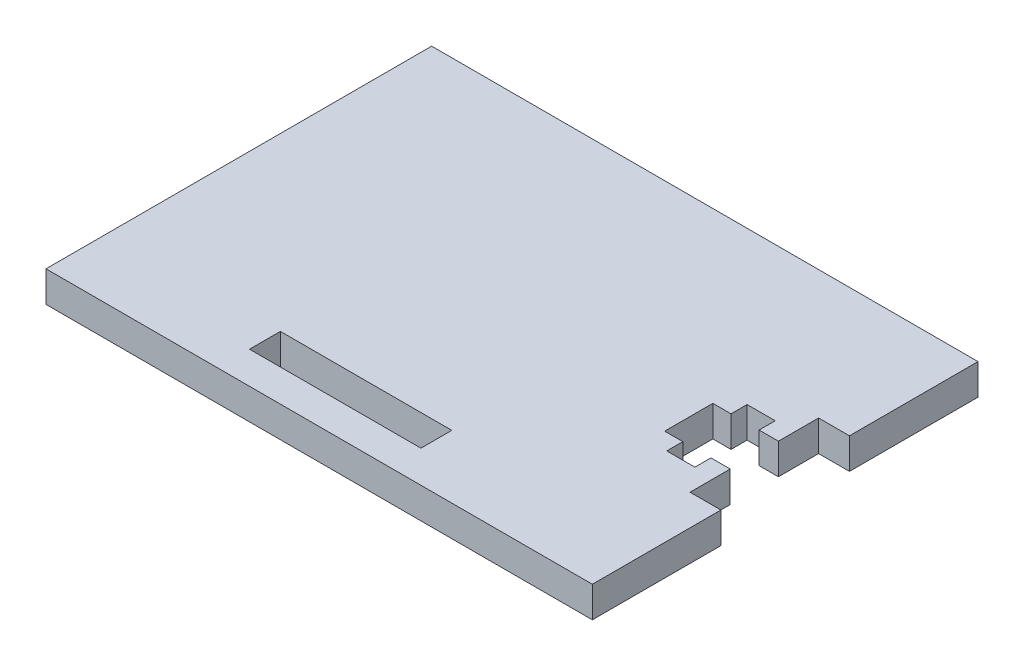
ISO-10303-21;
HEADER;
FILE_DESCRIPTION(('STEP AP214'),'2;1');
FILE_NAME('part.step','',(''),(''),'','','');
FILE_SCHEMA(('AUTOMOTIVE_DESIGN { 1 0 10303 214 1 1 1 1 }'));
ENDSEC;
DATA;
#1=APPLICATION_CONTEXT('core data for automotive mechanical design processes');
#2=APPLICATION_PROTOCOL_DEFINITION('international standard','automotive_design',2000,#1);
#3=PRODUCT_CONTEXT('',#1,'mechanical');
#4=PRODUCT('Part','Part','',(#3));
#5=PRODUCT_RELATED_PRODUCT_CATEGORY('part','',(#4));
#6=PRODUCT_DEFINITION_FORMATION('','',#4);
#7=PRODUCT_DEFINITION_CONTEXT('part definition',#1,'design');
#8=PRODUCT_DEFINITION('design','',#6,#7);
#9=PRODUCT_DEFINITION_SHAPE('','',#8);
#10=(LENGTH_UNIT() NAMED_UNIT(*) SI_UNIT(.MILLI.,.METRE.));
#11=(NAMED_UNIT(*) PLANE_ANGLE_UNIT() SI_UNIT($,.RADIAN.));
#12=(NAMED_UNIT(*) SI_UNIT($,.STERADIAN.) SOLID_ANGLE_UNIT());
#13=UNCERTAINTY_MEASURE_WITH_UNIT(LENGTH_MEASURE(1.E-05),#10,'distance_accuracy_value','');
#14=(GEOMETRIC_REPRESENTATION_CONTEXT(3) GLOBAL_UNCERTAINTY_ASSIGNED_CONTEXT((#13)) GLOBAL_UNIT_ASSIGNED_CONTEXT((#10,
#11,#12)) REPRESENTATION_CONTEXT('',''));
#15=CARTESIAN_POINT('',(0.,0.,0.));
#16=DIRECTION('',(0.,0.,1.));
#17=DIRECTION('',(1.,0.,0.));
#18=AXIS2_PLACEMENT_3D('',#15,#16,#17);
#19=CARTESIAN_POINT('',(0.,3.048,-25.4000000000001));
#20=DIRECTION('',(0.,0.,1.));
#21=DIRECTION('',(1.,0.,0.));
#22=AXIS2_PLACEMENT_3D('',#19,#20,#21);
#23=PLANE('',#22);
#24=DIRECTION('',(-1.,0.,0.));
#25=VECTOR('',#24,1.);
#26=CARTESIAN_POINT('',(0.,0.,-25.4000000000001));
#27=LINE('',#26,#25);
#28=CARTESIAN_POINT('',(53.975,0.,-25.4));
#29=VERTEX_POINT('',#28);
#30=CARTESIAN_POINT('',(50.927,0.,-25.4));
#31=VERTEX_POINT('',#30);
#32=EDGE_CURVE('E245',#29,#31,#27,.T.);
#33=ORIENTED_EDGE('',*,*,#32,.F.);
#34=DIRECTION('',(0.,-1.,0.));
#35=VECTOR('',#34,1.);
#36=CARTESIAN_POINT('',(53.975,3.048,-25.4));
#37=LINE('',#36,#35);
#38=CARTESIAN_POINT('',(53.975,3.048,-25.4));
#39=VERTEX_POINT('',#38);
#40=EDGE_CURVE('E11',#39,#29,#37,.T.);
#41=ORIENTED_EDGE('',*,*,#40,.F.);
#42=DIRECTION('',(-1.,0.,0.));
#43=VECTOR('',#42,1.);
#44=CARTESIAN_POINT('',(0.,3.048,-25.4000000000001));
#45=LINE('',#44,#43);
#46=CARTESIAN_POINT('',(50.927,3.048,-25.4));
#47=VERTEX_POINT('',#46);
#48=EDGE_CURVE('E452',#39,#47,#45,.T.);
#49=ORIENTED_EDGE('',*,*,#48,.T.);
#50=DIRECTION('',(0.,-1.,0.));
#51=VECTOR('',#50,1.);
#52=CARTESIAN_POINT('',(50.927,3.048,-25.4));
#53=LINE('',#52,#51);
#54=EDGE_CURVE('E54',#47,#31,#53,.T.);
#55=ORIENTED_EDGE('',*,*,#54,.T.);
#56=EDGE_LOOP('',(#33,#41,#49,#55));
#57=FACE_BOUND('',#56,.T.);
#58=ADVANCED_FACE('F35',(#57),#23,.T.);
#59=CARTESIAN_POINT('',(53.975,3.048,0.));
#60=DIRECTION('',(-1.,0.,0.));
#61=DIRECTION('',(0.,0.,1.));
#62=AXIS2_PLACEMENT_3D('',#59,#60,#61);
#63=PLANE('',#62);
#64=DIRECTION('',(0.,0.,-1.));
#65=VECTOR('',#64,1.);
#66=CARTESIAN_POINT('',(53.975,0.,0.));
#67=LINE('',#66,#65);
#68=CARTESIAN_POINT('',(53.975,0.,-38.1));
#69=VERTEX_POINT('',#68);
#70=EDGE_CURVE('E247',#29,#69,#67,.T.);
#71=ORIENTED_EDGE('',*,*,#70,.T.);
#72=DIRECTION('',(0.,-1.,0.));
#73=VECTOR('',#72,1.);
#74=CARTESIAN_POINT('',(53.975,3.048,-38.1));
#75=LINE('',#74,#73);
#76=CARTESIAN_POINT('',(53.975,3.048,-38.1));
#77=VERTEX_POINT('',#76);
#78=EDGE_CURVE('E45',#77,#69,#75,.T.);
#79=ORIENTED_EDGE('',*,*,#78,.F.);
#80=DIRECTION('',(0.,0.,-1.));
#81=VECTOR('',#80,1.);
#82=CARTESIAN_POINT('',(53.975,3.048,0.));
#83=LINE('',#82,#81);
#84=EDGE_CURVE('E454',#39,#77,#83,.T.);
#85=ORIENTED_EDGE('',*,*,#84,.F.);
#86=ORIENTED_EDGE('',*,*,#40,.T.);
#87=EDGE_LOOP('',(#71,#79,#85,#86));
#88=FACE_BOUND('',#87,.T.);
#89=ADVANCED_FACE('F366',(#88),#63,.F.);
#90=CARTESIAN_POINT('',(0.,3.048,-38.1));
#91=DIRECTION('',(0.,0.,-1.));
#92=DIRECTION('',(-1.,0.,0.));
#93=AXIS2_PLACEMENT_3D('',#90,#91,#92);
#94=PLANE('',#93);
#95=DIRECTION('',(1.,0.,0.));
#96=VECTOR('',#95,1.);
#97=CARTESIAN_POINT('',(0.,0.,-38.1));
#98=LINE('',#97,#96);
#99=CARTESIAN_POINT('',(0.,0.,-38.1));
#100=VERTEX_POINT('',#99);
#101=EDGE_CURVE('E250',#100,#69,#98,.T.);
#102=ORIENTED_EDGE('',*,*,#101,.F.);
#103=DIRECTION('',(0.,-1.,0.));
#104=VECTOR('',#103,1.);
#105=CARTESIAN_POINT('',(0.,3.048,-38.1));
#106=LINE('',#105,#104);
#107=CARTESIAN_POINT('',(0.,3.048,-38.1));
#108=VERTEX_POINT('',#107);
#109=EDGE_CURVE('E332',#108,#100,#106,.T.);
#110=ORIENTED_EDGE('',*,*,#109,.F.);
#111=DIRECTION('',(1.,0.,0.));
#112=VECTOR('',#111,1.);
#113=CARTESIAN_POINT('',(0.,3.048,-38.1));
#114=LINE('',#113,#112);
#115=EDGE_CURVE('E456',#108,#77,#114,.T.);
#116=ORIENTED_EDGE('',*,*,#115,.T.);
#117=ORIENTED_EDGE('',*,*,#78,.T.);
#118=EDGE_LOOP('',(#102,#110,#116,#117));
#119=FACE_BOUND('',#118,.T.);
#120=ADVANCED_FACE('F371',(#119),#94,.T.);
#121=CARTESIAN_POINT('',(0.,3.048,0.));
#122=DIRECTION('',(-1.,0.,0.));
#123=DIRECTION('',(0.,0.,1.));
#124=AXIS2_PLACEMENT_3D('',#121,#122,#123);
#125=PLANE('',#124);
#126=DIRECTION('',(0.,0.,-1.));
#127=VECTOR('',#126,1.);
#128=CARTESIAN_POINT('',(0.,0.,0.));
#129=LINE('',#128,#127);
#130=CARTESIAN_POINT('',(0.,0.,0.));
#131=VERTEX_POINT('',#130);
#132=EDGE_CURVE('E253',#131,#100,#129,.T.);
#133=ORIENTED_EDGE('',*,*,#132,.F.);
#134=DIRECTION('',(0.,-1.,0.));
#135=VECTOR('',#134,1.);
#136=CARTESIAN_POINT('',(0.,3.048,0.));
#137=LINE('',#136,#135);
#138=CARTESIAN_POINT('',(0.,3.048,0.));
#139=VERTEX_POINT('',#138);
#140=EDGE_CURVE('E330',#139,#131,#137,.T.);
#141=ORIENTED_EDGE('',*,*,#140,.F.);
#142=DIRECTION('',(0.,0.,-1.));
#143=VECTOR('',#142,1.);
#144=CARTESIAN_POINT('',(0.,3.048,0.));
#145=LINE('',#144,#143);
#146=EDGE_CURVE('E459',#139,#108,#145,.T.);
#147=ORIENTED_EDGE('',*,*,#146,.T.);
#148=ORIENTED_EDGE('',*,*,#109,.T.);
#149=EDGE_LOOP('',(#133,#141,#147,#148));
#150=FACE_BOUND('',#149,.T.);
#151=ADVANCED_FACE('F377',(#150),#125,.T.);
#152=CARTESIAN_POINT('',(0.,3.048,0.));
#153=DIRECTION('',(0.,0.,-1.));
#154=DIRECTION('',(-1.,0.,0.));
#155=AXIS2_PLACEMENT_3D('',#152,#153,#154);
#156=PLANE('',#155);
#157=DIRECTION('',(1.,0.,0.));
#158=VECTOR('',#157,1.);
#159=CARTESIAN_POINT('',(0.,0.,0.));
#160=LINE('',#159,#158);
#161=CARTESIAN_POINT('',(53.975,0.,0.));
#162=VERTEX_POINT('',#161);
#163=EDGE_CURVE('E256',#131,#162,#160,.T.);
#164=ORIENTED_EDGE('',*,*,#163,.T.);
#165=DIRECTION('',(0.,-1.,0.));
#166=VECTOR('',#165,1.);
#167=CARTESIAN_POINT('',(53.975,3.048,0.));
#168=LINE('',#167,#166);
#169=CARTESIAN_POINT('',(53.975,3.048,0.));
#170=VERTEX_POINT('',#169);
#171=EDGE_CURVE('E327',#170,#162,#168,.T.);
#172=ORIENTED_EDGE('',*,*,#171,.F.);
#173=DIRECTION('',(1.,0.,0.));
#174=VECTOR('',#173,1.);
#175=CARTESIAN_POINT('',(0.,3.048,0.));
#176=LINE('',#175,#174);
#177=EDGE_CURVE('E462',#139,#170,#176,.T.);
#178=ORIENTED_EDGE('',*,*,#177,.F.);
#179=ORIENTED_EDGE('',*,*,#140,.T.);
#180=EDGE_LOOP('',(#164,#172,#178,#179));
#181=FACE_BOUND('',#180,.T.);
#182=ADVANCED_FACE('F381',(#181),#156,.F.);
#183=CARTESIAN_POINT('',(53.975,3.048,0.));
#184=DIRECTION('',(-1.,0.,0.));
#185=DIRECTION('',(0.,0.,1.));
#186=AXIS2_PLACEMENT_3D('',#183,#184,#185);
#187=PLANE('',#186);
#188=DIRECTION('',(0.,0.,-1.));
#189=VECTOR('',#188,1.);
#190=CARTESIAN_POINT('',(53.975,0.,0.));
#191=LINE('',#190,#189);
#192=CARTESIAN_POINT('',(53.975,0.,-12.7));
#193=VERTEX_POINT('',#192);
#194=EDGE_CURVE('E259',#162,#193,#191,.T.);
#195=ORIENTED_EDGE('',*,*,#194,.T.);
#196=DIRECTION('',(0.,-1.,0.));
#197=VECTOR('',#196,1.);
#198=CARTESIAN_POINT('',(53.975,3.048,-12.7));
#199=LINE('',#198,#197);
#200=CARTESIAN_POINT('',(53.975,3.048,-12.7));
#201=VERTEX_POINT('',#200);
#202=EDGE_CURVE('E325',#201,#193,#199,.T.);
#203=ORIENTED_EDGE('',*,*,#202,.F.);
#204=DIRECTION('',(0.,0.,-1.));
#205=VECTOR('',#204,1.);
#206=CARTESIAN_POINT('',(53.975,3.048,0.));
#207=LINE('',#206,#205);
#208=EDGE_CURVE('E465',#170,#201,#207,.T.);
#209=ORIENTED_EDGE('',*,*,#208,.F.);
#210=ORIENTED_EDGE('',*,*,#171,.T.);
#211=EDGE_LOOP('',(#195,#203,#209,#210));
#212=FACE_BOUND('',#211,.T.);
#213=ADVANCED_FACE('F385',(#212),#187,.F.);
#214=CARTESIAN_POINT('',(0.,3.048,-12.7));
#215=DIRECTION('',(0.,0.,-1.));
#216=DIRECTION('',(-1.,0.,0.));
#217=AXIS2_PLACEMENT_3D('',#214,#215,#216);
#218=PLANE('',#217);
#219=DIRECTION('',(1.,0.,0.));
#220=VECTOR('',#219,1.);
#221=CARTESIAN_POINT('',(0.,0.,-12.7));
#222=LINE('',#221,#220);
#223=CARTESIAN_POINT('',(50.927,0.,-12.7));
#224=VERTEX_POINT('',#223);
#225=EDGE_CURVE('E262',#224,#193,#222,.T.);
#226=ORIENTED_EDGE('',*,*,#225,.F.);
#227=DIRECTION('',(0.,-1.,0.));
#228=VECTOR('',#227,1.);
#229=CARTESIAN_POINT('',(50.927,3.048,-12.7));
#230=LINE('',#229,#228);
#231=CARTESIAN_POINT('',(50.927,3.048,-12.7));
#232=VERTEX_POINT('',#231);
#233=EDGE_CURVE('E323',#232,#224,#230,.T.);
#234=ORIENTED_EDGE('',*,*,#233,.F.);
#235=DIRECTION('',(1.,0.,0.));
#236=VECTOR('',#235,1.);
#237=CARTESIAN_POINT('',(0.,3.048,-12.7));
#238=LINE('',#237,#236);
#239=EDGE_CURVE('E467',#232,#201,#238,.T.);
#240=ORIENTED_EDGE('',*,*,#239,.T.);
#241=ORIENTED_EDGE('',*,*,#202,.T.);
#242=EDGE_LOOP('',(#226,#234,#240,#241));
#243=FACE_BOUND('',#242,.T.);
#244=ADVANCED_FACE('F389',(#243),#218,.T.);
#245=CARTESIAN_POINT('',(50.927,3.048,0.));
#246=DIRECTION('',(1.,0.,0.));
#247=DIRECTION('',(0.,0.,-1.));
#248=AXIS2_PLACEMENT_3D('',#245,#246,#247);
#249=PLANE('',#248);
#250=DIRECTION('',(0.,0.,1.));
#251=VECTOR('',#250,1.);
#252=CARTESIAN_POINT('',(50.927,0.,0.));
#253=LINE('',#252,#251);
#254=CARTESIAN_POINT('',(50.927,0.,-16.66875));
#255=VERTEX_POINT('',#254);
#256=EDGE_CURVE('E265',#255,#224,#253,.T.);
#257=ORIENTED_EDGE('',*,*,#256,.F.);
#258=DIRECTION('',(0.,-1.,0.));
#259=VECTOR('',#258,1.);
#260=CARTESIAN_POINT('',(50.927,3.048,-16.66875));
#261=LINE('',#260,#259);
#262=CARTESIAN_POINT('',(50.927,3.048,-16.66875));
#263=VERTEX_POINT('',#262);
#264=EDGE_CURVE('E321',#263,#255,#261,.T.);
#265=ORIENTED_EDGE('',*,*,#264,.F.);
#266=DIRECTION('',(0.,0.,1.));
#267=VECTOR('',#266,1.);
#268=CARTESIAN_POINT('',(50.927,3.048,0.));
#269=LINE('',#268,#267);
#270=EDGE_CURVE('E470',#263,#232,#269,.T.);
#271=ORIENTED_EDGE('',*,*,#270,.T.);
#272=ORIENTED_EDGE('',*,*,#233,.T.);
#273=EDGE_LOOP('',(#257,#265,#271,#272));
#274=FACE_BOUND('',#273,.T.);
#275=ADVANCED_FACE('F393',(#274),#249,.T.);
#276=CARTESIAN_POINT('',(0.,3.048,-16.66875));
#277=DIRECTION('',(0.,0.,-1.));
#278=DIRECTION('',(-1.,0.,0.));
#279=AXIS2_PLACEMENT_3D('',#276,#277,#278);
#280=PLANE('',#279);
#281=DIRECTION('',(1.,0.,0.));
#282=VECTOR('',#281,1.);
#283=CARTESIAN_POINT('',(0.,0.,-16.66875));
#284=LINE('',#283,#282);
#285=CARTESIAN_POINT('',(49.022,0.,-16.66875));
#286=VERTEX_POINT('',#285);
#287=EDGE_CURVE('E268',#286,#255,#284,.T.);
#288=ORIENTED_EDGE('',*,*,#287,.F.);
#289=DIRECTION('',(0.,-1.,0.));
#290=VECTOR('',#289,1.);
#291=CARTESIAN_POINT('',(49.022,3.048,-16.66875));
#292=LINE('',#291,#290);
#293=CARTESIAN_POINT('',(49.022,3.048,-16.66875));
#294=VERTEX_POINT('',#293);
#295=EDGE_CURVE('E319',#294,#286,#292,.T.);
#296=ORIENTED_EDGE('',*,*,#295,.F.);
#297=DIRECTION('',(1.,0.,0.));
#298=VECTOR('',#297,1.);
#299=CARTESIAN_POINT('',(0.,3.048,-16.66875));
#300=LINE('',#299,#298);
#301=EDGE_CURVE('E473',#294,#263,#300,.T.);
#302=ORIENTED_EDGE('',*,*,#301,.T.);
#303=ORIENTED_EDGE('',*,*,#264,.T.);
#304=EDGE_LOOP('',(#288,#296,#302,#303));
#305=FACE_BOUND('',#304,.T.);
#306=ADVANCED_FACE('F397',(#305),#280,.T.);
#307=CARTESIAN_POINT('',(49.022,3.048,0.));
#308=DIRECTION('',(-1.,0.,0.));
#309=DIRECTION('',(0.,0.,1.));
#310=AXIS2_PLACEMENT_3D('',#307,#308,#309);
#311=PLANE('',#310);
#312=DIRECTION('',(0.,0.,-1.));
#313=VECTOR('',#312,1.);
#314=CARTESIAN_POINT('',(49.022,0.,0.));
#315=LINE('',#314,#313);
#316=CARTESIAN_POINT('',(49.022,0.,-15.08125));
#317=VERTEX_POINT('',#316);
#318=EDGE_CURVE('E271',#317,#286,#315,.T.);
#319=ORIENTED_EDGE('',*,*,#318,.F.);
#320=DIRECTION('',(0.,-1.,0.));
#321=VECTOR('',#320,1.);
#322=CARTESIAN_POINT('',(49.022,3.048,-15.08125));
#323=LINE('',#322,#321);
#324=CARTESIAN_POINT('',(49.022,3.048,-15.08125));
#325=VERTEX_POINT('',#324);
#326=EDGE_CURVE('E317',#325,#317,#323,.T.);
#327=ORIENTED_EDGE('',*,*,#326,.F.);
#328=DIRECTION('',(0.,0.,-1.));
#329=VECTOR('',#328,1.);
#330=CARTESIAN_POINT('',(49.022,3.048,0.));
#331=LINE('',#330,#329);
#332=EDGE_CURVE('E476',#325,#294,#331,.T.);
#333=ORIENTED_EDGE('',*,*,#332,.T.);
#334=ORIENTED_EDGE('',*,*,#295,.T.);
#335=EDGE_LOOP('',(#319,#327,#333,#334));
#336=FACE_BOUND('',#335,.T.);
#337=ADVANCED_FACE('F401',(#336),#311,.T.);
#338=CARTESIAN_POINT('',(0.,3.048,-15.08125));
#339=DIRECTION('',(0.,0.,-1.));
#340=DIRECTION('',(-1.,0.,0.));
#341=AXIS2_PLACEMENT_3D('',#338,#339,#340);
#342=PLANE('',#341);
#343=DIRECTION('',(1.,0.,0.));
#344=VECTOR('',#343,1.);
#345=CARTESIAN_POINT('',(0.,0.,-15.08125));
#346=LINE('',#345,#344);
#347=CARTESIAN_POINT('',(46.243875,0.,-15.08125));
#348=VERTEX_POINT('',#347);
#349=EDGE_CURVE('E274',#348,#317,#346,.T.);
#350=ORIENTED_EDGE('',*,*,#349,.F.);
#351=DIRECTION('',(0.,-1.,0.));
#352=VECTOR('',#351,1.);
#353=CARTESIAN_POINT('',(46.243875,3.048,-15.08125));
#354=LINE('',#353,#352);
#355=CARTESIAN_POINT('',(46.243875,3.048,-15.08125));
#356=VERTEX_POINT('',#355);
#357=EDGE_CURVE('E315',#356,#348,#354,.T.);
#358=ORIENTED_EDGE('',*,*,#357,.F.);
#359=DIRECTION('',(1.,0.,0.));
#360=VECTOR('',#359,1.);
#361=CARTESIAN_POINT('',(0.,3.048,-15.08125));
#362=LINE('',#361,#360);
#363=EDGE_CURVE('E479',#356,#325,#362,.T.);
#364=ORIENTED_EDGE('',*,*,#363,.T.);
#365=ORIENTED_EDGE('',*,*,#326,.T.);
#366=EDGE_LOOP('',(#350,#358,#364,#365));
#367=FACE_BOUND('',#366,.T.);
#368=ADVANCED_FACE('F405',(#367),#342,.T.);
#369=CARTESIAN_POINT('',(46.243875,3.048,0.));
#370=DIRECTION('',(1.,0.,0.));
#371=DIRECTION('',(0.,0.,-1.));
#372=AXIS2_PLACEMENT_3D('',#369,#370,#371);
#373=PLANE('',#372);
#374=DIRECTION('',(0.,0.,1.));
#375=VECTOR('',#374,1.);
#376=CARTESIAN_POINT('',(46.243875,0.,0.));
#377=LINE('',#376,#375);
#378=CARTESIAN_POINT('',(46.243875,0.,-16.66875));
#379=VERTEX_POINT('',#378);
#380=EDGE_CURVE('E277',#379,#348,#377,.T.);
#381=ORIENTED_EDGE('',*,*,#380,.F.);
#382=DIRECTION('',(0.,-1.,0.));
#383=VECTOR('',#382,1.);
#384=CARTESIAN_POINT('',(46.243875,3.048,-16.66875));
#385=LINE('',#384,#383);
#386=CARTESIAN_POINT('',(46.243875,3.048,-16.66875));
#387=VERTEX_POINT('',#386);
#388=EDGE_CURVE('E313',#387,#379,#385,.T.);
#389=ORIENTED_EDGE('',*,*,#388,.F.);
#390=DIRECTION('',(0.,0.,1.));
#391=VECTOR('',#390,1.);
#392=CARTESIAN_POINT('',(46.243875,3.048,0.));
#393=LINE('',#392,#391);
#394=EDGE_CURVE('E482',#387,#356,#393,.T.);
#395=ORIENTED_EDGE('',*,*,#394,.T.);
#396=ORIENTED_EDGE('',*,*,#357,.T.);
#397=EDGE_LOOP('',(#381,#389,#395,#396));
#398=FACE_BOUND('',#397,.T.);
#399=ADVANCED_FACE('F409',(#398),#373,.T.);
#400=CARTESIAN_POINT('',(0.,3.048,-16.66875));
#401=DIRECTION('',(0.,0.,-1.));
#402=DIRECTION('',(-1.,0.,0.));
#403=AXIS2_PLACEMENT_3D('',#400,#401,#402);
#404=PLANE('',#403);
#405=DIRECTION('',(1.,0.,0.));
#406=VECTOR('',#405,1.);
#407=CARTESIAN_POINT('',(0.,0.,-16.66875));
#408=LINE('',#407,#406);
#409=CARTESIAN_POINT('',(44.45,0.,-16.66875));
#410=VERTEX_POINT('',#409);
#411=EDGE_CURVE('E280',#410,#379,#408,.T.);
#412=ORIENTED_EDGE('',*,*,#411,.F.);
#413=DIRECTION('',(0.,-1.,0.));
#414=VECTOR('',#413,1.);
#415=CARTESIAN_POINT('',(44.45,3.048,-16.66875));
#416=LINE('',#415,#414);
#417=CARTESIAN_POINT('',(44.45,3.048,-16.66875));
#418=VERTEX_POINT('',#417);
#419=EDGE_CURVE('E311',#418,#410,#416,.T.);
#420=ORIENTED_EDGE('',*,*,#419,.F.);
#421=DIRECTION('',(1.,0.,0.));
#422=VECTOR('',#421,1.);
#423=CARTESIAN_POINT('',(0.,3.048,-16.66875));
#424=LINE('',#423,#422);
#425=EDGE_CURVE('E485',#418,#387,#424,.T.);
#426=ORIENTED_EDGE('',*,*,#425,.T.);
#427=ORIENTED_EDGE('',*,*,#388,.T.);
#428=EDGE_LOOP('',(#412,#420,#426,#427));
#429=FACE_BOUND('',#428,.T.);
#430=ADVANCED_FACE('F413',(#429),#404,.T.);
#431=CARTESIAN_POINT('',(44.45,3.048,0.));
#432=DIRECTION('',(1.,0.,0.));
#433=DIRECTION('',(0.,0.,-1.));
#434=AXIS2_PLACEMENT_3D('',#431,#432,#433);
#435=PLANE('',#434);
#436=DIRECTION('',(0.,0.,1.));
#437=VECTOR('',#436,1.);
#438=CARTESIAN_POINT('',(44.45,0.,0.));
#439=LINE('',#438,#437);
#440=CARTESIAN_POINT('',(44.45,0.,-21.43125));
#441=VERTEX_POINT('',#440);
#442=EDGE_CURVE('E283',#441,#410,#439,.T.);
#443=ORIENTED_EDGE('',*,*,#442,.F.);
#444=DIRECTION('',(0.,-1.,0.));
#445=VECTOR('',#444,1.);
#446=CARTESIAN_POINT('',(44.45,3.048,-21.43125));
#447=LINE('',#446,#445);
#448=CARTESIAN_POINT('',(44.45,3.048,-21.43125));
#449=VERTEX_POINT('',#448);
#450=EDGE_CURVE('E309',#449,#441,#447,.T.);
#451=ORIENTED_EDGE('',*,*,#450,.F.);
#452=DIRECTION('',(0.,0.,1.));
#453=VECTOR('',#452,1.);
#454=CARTESIAN_POINT('',(44.45,3.048,0.));
#455=LINE('',#454,#453);
#456=EDGE_CURVE('E488',#449,#418,#455,.T.);
#457=ORIENTED_EDGE('',*,*,#456,.T.);
#458=ORIENTED_EDGE('',*,*,#419,.T.);
#459=EDGE_LOOP('',(#443,#451,#457,#458));
#460=FACE_BOUND('',#459,.T.);
#461=ADVANCED_FACE('F417',(#460),#435,.T.);
#462=CARTESIAN_POINT('',(0.,3.048,-21.43125));
#463=DIRECTION('',(0.,0.,1.));
#464=DIRECTION('',(1.,0.,0.));
#465=AXIS2_PLACEMENT_3D('',#462,#463,#464);
#466=PLANE('',#465);
#467=DIRECTION('',(-1.,0.,0.));
#468=VECTOR('',#467,1.);
#469=CARTESIAN_POINT('',(0.,0.,-21.43125));
#470=LINE('',#469,#468);
#471=CARTESIAN_POINT('',(46.243875,0.,-21.43125));
#472=VERTEX_POINT('',#471);
#473=EDGE_CURVE('E286',#472,#441,#470,.T.);
#474=ORIENTED_EDGE('',*,*,#473,.F.);
#475=DIRECTION('',(0.,-1.,0.));
#476=VECTOR('',#475,1.);
#477=CARTESIAN_POINT('',(46.243875,3.048,-21.43125));
#478=LINE('',#477,#476);
#479=CARTESIAN_POINT('',(46.243875,3.048,-21.43125));
#480=VERTEX_POINT('',#479);
#481=EDGE_CURVE('E307',#480,#472,#478,.T.);
#482=ORIENTED_EDGE('',*,*,#481,.F.);
#483=DIRECTION('',(-1.,0.,0.));
#484=VECTOR('',#483,1.);
#485=CARTESIAN_POINT('',(0.,3.048,-21.43125));
#486=LINE('',#485,#484);
#487=EDGE_CURVE('E491',#480,#449,#486,.T.);
#488=ORIENTED_EDGE('',*,*,#487,.T.);
#489=ORIENTED_EDGE('',*,*,#450,.T.);
#490=EDGE_LOOP('',(#474,#482,#488,#489));
#491=FACE_BOUND('',#490,.T.);
#492=ADVANCED_FACE('F421',(#491),#466,.T.);
#493=CARTESIAN_POINT('',(46.243875,3.048,0.));
#494=DIRECTION('',(1.,0.,0.));
#495=DIRECTION('',(0.,0.,-1.));
#496=AXIS2_PLACEMENT_3D('',#493,#494,#495);
#497=PLANE('',#496);
#498=DIRECTION('',(0.,0.,1.));
#499=VECTOR('',#498,1.);
#500=CARTESIAN_POINT('',(46.243875,0.,0.));
#501=LINE('',#500,#499);
#502=CARTESIAN_POINT('',(46.243875,0.,-23.01875));
#503=VERTEX_POINT('',#502);
#504=EDGE_CURVE('E289',#503,#472,#501,.T.);
#505=ORIENTED_EDGE('',*,*,#504,.F.);
#506=DIRECTION('',(0.,-1.,0.));
#507=VECTOR('',#506,1.);
#508=CARTESIAN_POINT('',(46.243875,3.048,-23.01875));
#509=LINE('',#508,#507);
#510=CARTESIAN_POINT('',(46.243875,3.048,-23.01875));
#511=VERTEX_POINT('',#510);
#512=EDGE_CURVE('E305',#511,#503,#509,.T.);
#513=ORIENTED_EDGE('',*,*,#512,.F.);
#514=DIRECTION('',(0.,0.,1.));
#515=VECTOR('',#514,1.);
#516=CARTESIAN_POINT('',(46.243875,3.048,0.));
#517=LINE('',#516,#515);
#518=EDGE_CURVE('E494',#511,#480,#517,.T.);
#519=ORIENTED_EDGE('',*,*,#518,.T.);
#520=ORIENTED_EDGE('',*,*,#481,.T.);
#521=EDGE_LOOP('',(#505,#513,#519,#520));
#522=FACE_BOUND('',#521,.T.);
#523=ADVANCED_FACE('F425',(#522),#497,.T.);
#524=CARTESIAN_POINT('',(0.,3.048,-23.0187499999999));
#525=DIRECTION('',(0.,0.,1.));
#526=DIRECTION('',(1.,0.,0.));
#527=AXIS2_PLACEMENT_3D('',#524,#525,#526);
#528=PLANE('',#527);
#529=DIRECTION('',(-1.,0.,0.));
#530=VECTOR('',#529,1.);
#531=CARTESIAN_POINT('',(0.,0.,-23.0187499999999));
#532=LINE('',#531,#530);
#533=CARTESIAN_POINT('',(49.022,0.,-23.01875));
#534=VERTEX_POINT('',#533);
#535=EDGE_CURVE('E292',#534,#503,#532,.T.);
#536=ORIENTED_EDGE('',*,*,#535,.F.);
#537=DIRECTION('',(0.,-1.,0.));
#538=VECTOR('',#537,1.);
#539=CARTESIAN_POINT('',(49.022,3.048,-23.01875));
#540=LINE('',#539,#538);
#541=CARTESIAN_POINT('',(49.022,3.048,-23.01875));
#542=VERTEX_POINT('',#541);
#543=EDGE_CURVE('E213',#542,#534,#540,.T.);
#544=ORIENTED_EDGE('',*,*,#543,.F.);
#545=DIRECTION('',(-1.,0.,0.));
#546=VECTOR('',#545,1.);
#547=CARTESIAN_POINT('',(0.,3.048,-23.0187499999999));
#548=LINE('',#547,#546);
#549=EDGE_CURVE('E224',#542,#511,#548,.T.);
#550=ORIENTED_EDGE('',*,*,#549,.T.);
#551=ORIENTED_EDGE('',*,*,#512,.T.);
#552=EDGE_LOOP('',(#536,#544,#550,#551));
#553=FACE_BOUND('',#552,.T.);
#554=ADVANCED_FACE('F429',(#553),#528,.T.);
#555=CARTESIAN_POINT('',(49.022,3.048,0.));
#556=DIRECTION('',(-1.,0.,0.));
#557=DIRECTION('',(0.,0.,1.));
#558=AXIS2_PLACEMENT_3D('',#555,#556,#557);
#559=PLANE('',#558);
#560=DIRECTION('',(0.,0.,-1.));
#561=VECTOR('',#560,1.);
#562=CARTESIAN_POINT('',(49.022,0.,0.));
#563=LINE('',#562,#561);
#564=CARTESIAN_POINT('',(49.022,0.,-21.43125));
#565=VERTEX_POINT('',#564);
#566=EDGE_CURVE('E209',#565,#534,#563,.T.);
#567=ORIENTED_EDGE('',*,*,#566,.F.);
#568=DIRECTION('',(0.,-1.,0.));
#569=VECTOR('',#568,1.);
#570=CARTESIAN_POINT('',(49.022,3.048,-21.43125));
#571=LINE('',#570,#569);
#572=CARTESIAN_POINT('',(49.022,3.048,-21.43125));
#573=VERTEX_POINT('',#572);
#574=EDGE_CURVE('E204',#573,#565,#571,.T.);
#575=ORIENTED_EDGE('',*,*,#574,.F.);
#576=DIRECTION('',(0.,0.,-1.));
#577=VECTOR('',#576,1.);
#578=CARTESIAN_POINT('',(49.022,3.048,0.));
#579=LINE('',#578,#577);
#580=EDGE_CURVE('E207',#573,#542,#579,.T.);
#581=ORIENTED_EDGE('',*,*,#580,.T.);
#582=ORIENTED_EDGE('',*,*,#543,.T.);
#583=EDGE_LOOP('',(#567,#575,#581,#582));
#584=FACE_BOUND('',#583,.T.);
#585=ADVANCED_FACE('F206',(#584),#559,.T.);
#586=CARTESIAN_POINT('',(-1.5612511283791E-13,3.048,-21.4312499999996));
#587=DIRECTION('',(0.,0.,1.));
#588=DIRECTION('',(1.,0.,0.));
#589=AXIS2_PLACEMENT_3D('',#586,#587,#588);
#590=PLANE('',#589);
#591=DIRECTION('',(-1.,0.,0.));
#592=VECTOR('',#591,1.);
#593=CARTESIAN_POINT('',(-1.5612511283791E-13,0.,-21.4312499999996));
#594=LINE('',#593,#592);
#595=CARTESIAN_POINT('',(50.927,0.,-21.43125));
#596=VERTEX_POINT('',#595);
#597=EDGE_CURVE('E296',#596,#565,#594,.T.);
#598=ORIENTED_EDGE('',*,*,#597,.F.);
#599=DIRECTION('',(0.,-1.,0.));
#600=VECTOR('',#599,1.);
#601=CARTESIAN_POINT('',(50.927,3.048,-21.43125));
#602=LINE('',#601,#600);
#603=CARTESIAN_POINT('',(50.927,3.048,-21.43125));
#604=VERTEX_POINT('',#603);
#605=EDGE_CURVE('E127',#604,#596,#602,.T.);
#606=ORIENTED_EDGE('',*,*,#605,.F.);
#607=DIRECTION('',(-1.,0.,0.));
#608=VECTOR('',#607,1.);
#609=CARTESIAN_POINT('',(-1.5612511283791E-13,3.048,-21.4312499999996));
#610=LINE('',#609,#608);
#611=EDGE_CURVE('E221',#604,#573,#610,.T.);
#612=ORIENTED_EDGE('',*,*,#611,.T.);
#613=ORIENTED_EDGE('',*,*,#574,.T.);
#614=EDGE_LOOP('',(#598,#606,#612,#613));
#615=FACE_BOUND('',#614,.T.);
#616=ADVANCED_FACE('F226',(#615),#590,.T.);
#617=CARTESIAN_POINT('',(0.,3.048,-6.223));
#618=DIRECTION('',(0.,0.,-1.));
#619=DIRECTION('',(-1.,0.,0.));
#620=AXIS2_PLACEMENT_3D('',#617,#618,#619);
#621=PLANE('',#620);
#622=DIRECTION('',(1.,0.,0.));
#623=VECTOR('',#622,1.);
#624=CARTESIAN_POINT('',(0.,0.,-6.223));
#625=LINE('',#624,#623);
#626=CARTESIAN_POINT('',(16.9333333333333,0.,-6.223));
#627=VERTEX_POINT('',#626);
#628=CARTESIAN_POINT('',(33.8666667513333,0.,-6.223));
#629=VERTEX_POINT('',#628);
#630=EDGE_CURVE('E233',#627,#629,#625,.T.);
#631=ORIENTED_EDGE('',*,*,#630,.T.);
#632=DIRECTION('',(0.,-1.,0.));
#633=VECTOR('',#632,1.);
#634=CARTESIAN_POINT('',(33.8666667513333,3.048,-6.223));
#635=LINE('',#634,#633);
#636=CARTESIAN_POINT('',(33.8666667513333,3.048,-6.223));
#637=VERTEX_POINT('',#636);
#638=EDGE_CURVE('E39',#637,#629,#635,.T.);
#639=ORIENTED_EDGE('',*,*,#638,.F.);
#640=DIRECTION('',(1.,0.,0.));
#641=VECTOR('',#640,1.);
#642=CARTESIAN_POINT('',(0.,3.048,-6.223));
#643=LINE('',#642,#641);
#644=CARTESIAN_POINT('',(16.9333333333333,3.048,-6.223));
#645=VERTEX_POINT('',#644);
#646=EDGE_CURVE('E301',#645,#637,#643,.T.);
#647=ORIENTED_EDGE('',*,*,#646,.F.);
#648=DIRECTION('',(0.,-1.,0.));
#649=VECTOR('',#648,1.);
#650=CARTESIAN_POINT('',(16.9333333333333,3.048,-6.223));
#651=LINE('',#650,#649);
#652=EDGE_CURVE('E229',#645,#627,#651,.T.);
#653=ORIENTED_EDGE('',*,*,#652,.T.);
#654=EDGE_LOOP('',(#631,#639,#647,#653));
#655=FACE_BOUND('',#654,.T.);
#656=ADVANCED_FACE('F37',(#655),#621,.F.);
#657=CARTESIAN_POINT('',(33.8666667513333,3.048,0.));
#658=DIRECTION('',(1.,0.,0.));
#659=DIRECTION('',(0.,0.,-1.));
#660=AXIS2_PLACEMENT_3D('',#657,#658,#659);
#661=PLANE('',#660);
#662=DIRECTION('',(0.,0.,1.));
#663=VECTOR('',#662,1.);
#664=CARTESIAN_POINT('',(33.8666667513333,0.,0.));
#665=LINE('',#664,#663);
#666=CARTESIAN_POINT('',(33.8666667513333,0.,-3.175));
#667=VERTEX_POINT('',#666);
#668=EDGE_CURVE('E236',#629,#667,#665,.T.);
#669=ORIENTED_EDGE('',*,*,#668,.T.);
#670=DIRECTION('',(0.,-1.,0.));
#671=VECTOR('',#670,1.);
#672=CARTESIAN_POINT('',(33.8666667513333,3.048,-3.175));
#673=LINE('',#672,#671);
#674=CARTESIAN_POINT('',(33.8666667513333,3.048,-3.175));
#675=VERTEX_POINT('',#674);
#676=EDGE_CURVE('E337',#675,#667,#673,.T.);
#677=ORIENTED_EDGE('',*,*,#676,.F.);
#678=DIRECTION('',(0.,0.,1.));
#679=VECTOR('',#678,1.);
#680=CARTESIAN_POINT('',(33.8666667513333,3.048,0.));
#681=LINE('',#680,#679);
#682=EDGE_CURVE('E140',#637,#675,#681,.T.);
#683=ORIENTED_EDGE('',*,*,#682,.F.);
#684=ORIENTED_EDGE('',*,*,#638,.T.);
#685=EDGE_LOOP('',(#669,#677,#683,#684));
#686=FACE_BOUND('',#685,.T.);
#687=ADVANCED_FACE('F342',(#686),#661,.F.);
#688=CARTESIAN_POINT('',(0.,3.048,-3.175));
#689=DIRECTION('',(0.,0.,-1.));
#690=DIRECTION('',(-1.,0.,0.));
#691=AXIS2_PLACEMENT_3D('',#688,#689,#690);
#692=PLANE('',#691);
#693=DIRECTION('',(1.,0.,0.));
#694=VECTOR('',#693,1.);
#695=CARTESIAN_POINT('',(0.,0.,-3.175));
#696=LINE('',#695,#694);
#697=CARTESIAN_POINT('',(16.9333333333333,0.,-3.175));
#698=VERTEX_POINT('',#697);
#699=EDGE_CURVE('E239',#698,#667,#696,.T.);
#700=ORIENTED_EDGE('',*,*,#699,.F.);
#701=DIRECTION('',(0.,-1.,0.));
#702=VECTOR('',#701,1.);
#703=CARTESIAN_POINT('',(16.9333333333333,3.048,-3.175));
#704=LINE('',#703,#702);
#705=CARTESIAN_POINT('',(16.9333333333333,3.048,-3.175));
#706=VERTEX_POINT('',#705);
#707=EDGE_CURVE('E336',#706,#698,#704,.T.);
#708=ORIENTED_EDGE('',*,*,#707,.F.);
#709=DIRECTION('',(1.,0.,0.));
#710=VECTOR('',#709,1.);
#711=CARTESIAN_POINT('',(0.,3.048,-3.175));
#712=LINE('',#711,#710);
#713=EDGE_CURVE('E447',#706,#675,#712,.T.);
#714=ORIENTED_EDGE('',*,*,#713,.T.);
#715=ORIENTED_EDGE('',*,*,#676,.T.);
#716=EDGE_LOOP('',(#700,#708,#714,#715));
#717=FACE_BOUND('',#716,.T.);
#718=ADVANCED_FACE('F356',(#717),#692,.T.);
#719=CARTESIAN_POINT('',(16.9333333333333,3.048,0.));
#720=DIRECTION('',(1.,0.,0.));
#721=DIRECTION('',(0.,0.,-1.));
#722=AXIS2_PLACEMENT_3D('',#719,#720,#721);
#723=PLANE('',#722);
#724=DIRECTION('',(0.,0.,1.));
#725=VECTOR('',#724,1.);
#726=CARTESIAN_POINT('',(16.9333333333333,0.,0.));
#727=LINE('',#726,#725);
#728=EDGE_CURVE('E242',#627,#698,#727,.T.);
#729=ORIENTED_EDGE('',*,*,#728,.F.);
#730=ORIENTED_EDGE('',*,*,#652,.F.);
#731=DIRECTION('',(0.,0.,1.));
#732=VECTOR('',#731,1.);
#733=CARTESIAN_POINT('',(16.9333333333333,3.048,0.));
#734=LINE('',#733,#732);
#735=EDGE_CURVE('E354',#645,#706,#734,.T.);
#736=ORIENTED_EDGE('',*,*,#735,.T.);
#737=ORIENTED_EDGE('',*,*,#707,.T.);
#738=EDGE_LOOP('',(#729,#730,#736,#737));
#739=FACE_BOUND('',#738,.T.);
#740=ADVANCED_FACE('F351',(#739),#723,.T.);
#741=CARTESIAN_POINT('',(50.927,3.048,0.));
#742=DIRECTION('',(1.,0.,0.));
#743=DIRECTION('',(0.,0.,-1.));
#744=AXIS2_PLACEMENT_3D('',#741,#742,#743);
#745=PLANE('',#744);
#746=DIRECTION('',(0.,0.,1.));
#747=VECTOR('',#746,1.);
#748=CARTESIAN_POINT('',(50.927,0.,0.));
#749=LINE('',#748,#747);
#750=EDGE_CURVE('E298',#31,#596,#749,.T.);
#751=ORIENTED_EDGE('',*,*,#750,.F.);
#752=ORIENTED_EDGE('',*,*,#54,.F.);
#753=DIRECTION('',(0.,0.,1.));
#754=VECTOR('',#753,1.);
#755=CARTESIAN_POINT('',(50.927,3.048,0.));
#756=LINE('',#755,#754);
#757=EDGE_CURVE('E227',#47,#604,#756,.T.);
#758=ORIENTED_EDGE('',*,*,#757,.T.);
#759=ORIENTED_EDGE('',*,*,#605,.T.);
#760=EDGE_LOOP('',(#751,#752,#758,#759));
#761=FACE_BOUND('',#760,.T.);
#762=ADVANCED_FACE('F363',(#761),#745,.T.);
#763=CARTESIAN_POINT('',(0.,3.048,0.));
#764=DIRECTION('',(0.,1.,0.));
#765=DIRECTION('',(0.,0.,1.));
#766=AXIS2_PLACEMENT_3D('',#763,#764,#765);
#767=PLANE('',#766);
#768=ORIENTED_EDGE('',*,*,#646,.T.);
#769=ORIENTED_EDGE('',*,*,#682,.T.);
#770=ORIENTED_EDGE('',*,*,#713,.F.);
#771=ORIENTED_EDGE('',*,*,#735,.F.);
#772=EDGE_LOOP('',(#768,#769,#770,#771));
#773=FACE_BOUND('',#772,.T.);
#774=ORIENTED_EDGE('',*,*,#48,.F.);
#775=ORIENTED_EDGE('',*,*,#84,.T.);
#776=ORIENTED_EDGE('',*,*,#115,.F.);
#777=ORIENTED_EDGE('',*,*,#146,.F.);
#778=ORIENTED_EDGE('',*,*,#177,.T.);
#779=ORIENTED_EDGE('',*,*,#208,.T.);
#780=ORIENTED_EDGE('',*,*,#239,.F.);
#781=ORIENTED_EDGE('',*,*,#270,.F.);
#782=ORIENTED_EDGE('',*,*,#301,.F.);
#783=ORIENTED_EDGE('',*,*,#332,.F.);
#784=ORIENTED_EDGE('',*,*,#363,.F.);
#785=ORIENTED_EDGE('',*,*,#394,.F.);
#786=ORIENTED_EDGE('',*,*,#425,.F.);
#787=ORIENTED_EDGE('',*,*,#456,.F.);
#788=ORIENTED_EDGE('',*,*,#487,.F.);
#789=ORIENTED_EDGE('',*,*,#518,.F.);
#790=ORIENTED_EDGE('',*,*,#549,.F.);
#791=ORIENTED_EDGE('',*,*,#580,.F.);
#792=ORIENTED_EDGE('',*,*,#611,.F.);
#793=ORIENTED_EDGE('',*,*,#757,.F.);
#794=EDGE_LOOP('',(#774,#775,#776,#777,#778,#779,#780,#781,#782,#783,#784,#785,#786,#787,#788,
#789,#790,#791,#792,#793));
#795=FACE_BOUND('',#794,.T.);
#796=ADVANCED_FACE('F219',(#773,#795),#767,.T.);
#797=CARTESIAN_POINT('',(0.,0.,0.));
#798=DIRECTION('',(0.,1.,0.));
#799=DIRECTION('',(0.,0.,1.));
#800=AXIS2_PLACEMENT_3D('',#797,#798,#799);
#801=PLANE('',#800);
#802=ORIENTED_EDGE('',*,*,#630,.F.);
#803=ORIENTED_EDGE('',*,*,#728,.T.);
#804=ORIENTED_EDGE('',*,*,#699,.T.);
#805=ORIENTED_EDGE('',*,*,#668,.F.);
#806=EDGE_LOOP('',(#802,#803,#804,#805));
#807=FACE_BOUND('',#806,.T.);
#808=ORIENTED_EDGE('',*,*,#32,.T.);
#809=ORIENTED_EDGE('',*,*,#750,.T.);
#810=ORIENTED_EDGE('',*,*,#597,.T.);
#811=ORIENTED_EDGE('',*,*,#566,.T.);
#812=ORIENTED_EDGE('',*,*,#535,.T.);
#813=ORIENTED_EDGE('',*,*,#504,.T.);
#814=ORIENTED_EDGE('',*,*,#473,.T.);
#815=ORIENTED_EDGE('',*,*,#442,.T.);
#816=ORIENTED_EDGE('',*,*,#411,.T.);
#817=ORIENTED_EDGE('',*,*,#380,.T.);
#818=ORIENTED_EDGE('',*,*,#349,.T.);
#819=ORIENTED_EDGE('',*,*,#318,.T.);
#820=ORIENTED_EDGE('',*,*,#287,.T.);
#821=ORIENTED_EDGE('',*,*,#256,.T.);
#822=ORIENTED_EDGE('',*,*,#225,.T.);
#823=ORIENTED_EDGE('',*,*,#194,.F.);
#824=ORIENTED_EDGE('',*,*,#163,.F.);
#825=ORIENTED_EDGE('',*,*,#132,.T.);
#826=ORIENTED_EDGE('',*,*,#101,.T.);
#827=ORIENTED_EDGE('',*,*,#70,.F.);
#828=EDGE_LOOP('',(#808,#809,#810,#811,#812,#813,#814,#815,#816,#817,#818,#819,#820,#821,#822,
#823,#824,#825,#826,#827));
#829=FACE_BOUND('',#828,.T.);
#830=ADVANCED_FACE('F348',(#807,#829),#801,.F.);
#831=CLOSED_SHELL('',(#58,#89,#120,#151,#182,#213,#244,#275,#306,#337,#368,#399,#430,#461,#492,
#523,#554,#585,#616,#656,#687,#718,#740,#762,#796,#830));
#832=MANIFOLD_SOLID_BREP('B2',#831);
#833=ADVANCED_BREP_SHAPE_REPRESENTATION('',(#18,#832),#14);
#834=SHAPE_DEFINITION_REPRESENTATION(#9,#833);
ENDSEC;
END-ISO-10303-21;
